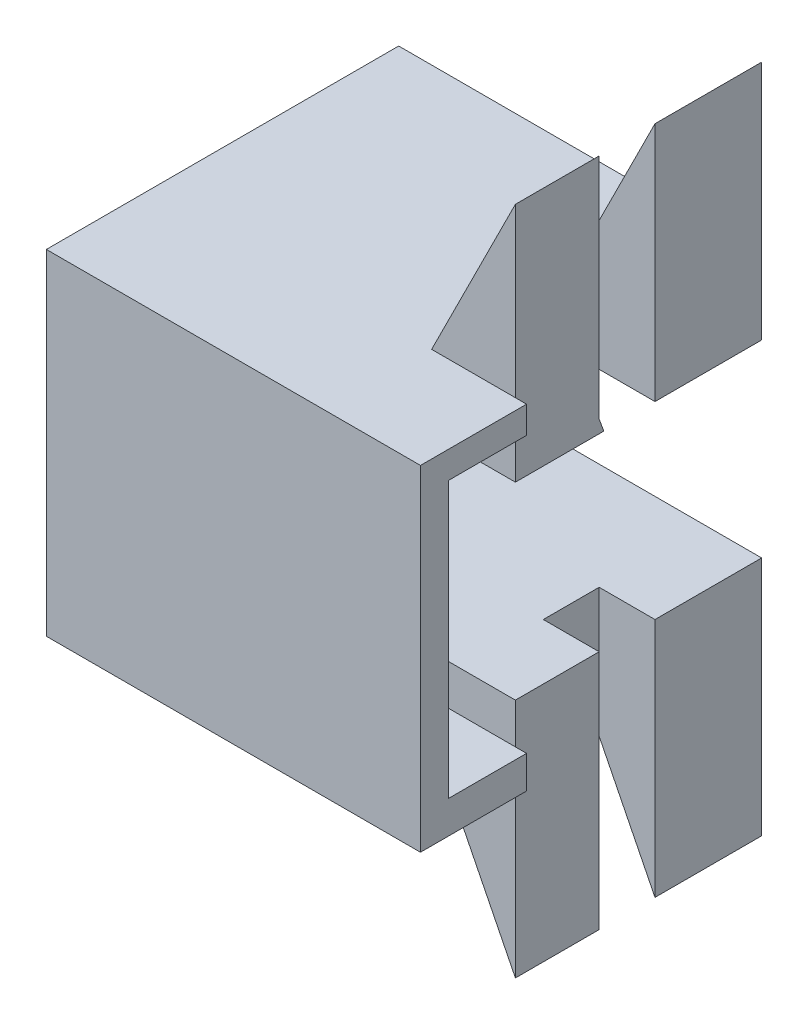
ISO-10303-21;
HEADER;
FILE_DESCRIPTION(('STEP AP214'),'2;1');
FILE_NAME('part.step','',(''),(''),'','','');
FILE_SCHEMA(('AUTOMOTIVE_DESIGN { 1 0 10303 214 1 1 1 1 }'));
ENDSEC;
DATA;
#1=APPLICATION_CONTEXT('core data for automotive mechanical design processes');
#2=APPLICATION_PROTOCOL_DEFINITION('international standard','automotive_design',2000,#1);
#3=PRODUCT_CONTEXT('',#1,'mechanical');
#4=PRODUCT('Part','Part','',(#3));
#5=PRODUCT_RELATED_PRODUCT_CATEGORY('part','',(#4));
#6=PRODUCT_DEFINITION_FORMATION('','',#4);
#7=PRODUCT_DEFINITION_CONTEXT('part definition',#1,'design');
#8=PRODUCT_DEFINITION('design','',#6,#7);
#9=PRODUCT_DEFINITION_SHAPE('','',#8);
#10=(LENGTH_UNIT() NAMED_UNIT(*) SI_UNIT(.MILLI.,.METRE.));
#11=(NAMED_UNIT(*) PLANE_ANGLE_UNIT() SI_UNIT($,.RADIAN.));
#12=(NAMED_UNIT(*) SI_UNIT($,.STERADIAN.) SOLID_ANGLE_UNIT());
#13=UNCERTAINTY_MEASURE_WITH_UNIT(LENGTH_MEASURE(1.E-05),#10,'distance_accuracy_value','');
#14=(GEOMETRIC_REPRESENTATION_CONTEXT(3) GLOBAL_UNCERTAINTY_ASSIGNED_CONTEXT((#13)) GLOBAL_UNIT_ASSIGNED_CONTEXT((#10,
#11,#12)) REPRESENTATION_CONTEXT('',''));
#15=CARTESIAN_POINT('',(0.,0.,0.));
#16=DIRECTION('',(0.,0.,1.));
#17=DIRECTION('',(1.,0.,0.));
#18=AXIS2_PLACEMENT_3D('',#15,#16,#17);
#19=CARTESIAN_POINT('',(0.,0.,44.1));
#20=DIRECTION('',(0.,0.,1.));
#21=DIRECTION('',(1.,0.,0.));
#22=AXIS2_PLACEMENT_3D('',#19,#20,#21);
#23=PLANE('',#22);
#24=DIRECTION('',(-1.,0.,0.));
#25=VECTOR('',#24,1.);
#26=CARTESIAN_POINT('',(0.,0.,44.1));
#27=LINE('',#26,#25);
#28=CARTESIAN_POINT('',(65.,0.,44.1));
#29=VERTEX_POINT('',#28);
#30=CARTESIAN_POINT('',(50.,0.,44.1));
#31=VERTEX_POINT('',#30);
#32=EDGE_CURVE('E11',#29,#31,#27,.T.);
#33=ORIENTED_EDGE('',*,*,#32,.F.);
#34=DIRECTION('',(0.,1.,0.));
#35=VECTOR('',#34,1.);
#36=CARTESIAN_POINT('',(65.,0.,44.1));
#37=LINE('',#36,#35);
#38=CARTESIAN_POINT('',(65.,30.,44.1));
#39=VERTEX_POINT('',#38);
#40=EDGE_CURVE('E378',#29,#39,#37,.T.);
#41=ORIENTED_EDGE('',*,*,#40,.T.);
#42=DIRECTION('',(-0.447213595499957,-0.894427190999916,0.));
#43=VECTOR('',#42,1.);
#44=CARTESIAN_POINT('',(40.,-20.,44.1));
#45=LINE('',#44,#43);
#46=EDGE_CURVE('E382',#39,#31,#45,.T.);
#47=ORIENTED_EDGE('',*,*,#46,.T.);
#48=EDGE_LOOP('',(#33,#41,#47));
#49=FACE_BOUND('',#48,.T.);
#50=ADVANCED_FACE('F37',(#49),#23,.T.);
#51=DIRECTION('',(1.,0.,0.));
#52=VECTOR('',#51,1.);
#53=CARTESIAN_POINT('',(67.,-4.83647532469433,44.1));
#54=LINE('',#53,#52);
#55=CARTESIAN_POINT('',(28.5,-4.83647532469434,44.1));
#56=VERTEX_POINT('',#55);
#57=CARTESIAN_POINT('',(65.,-4.83647532469433,44.1));
#58=VERTEX_POINT('',#57);
#59=EDGE_CURVE('E55',#56,#58,#54,.T.);
#60=ORIENTED_EDGE('',*,*,#59,.F.);
#61=DIRECTION('',(0.,1.,0.));
#62=VECTOR('',#61,1.);
#63=CARTESIAN_POINT('',(28.5,-4.83647532469434,44.1));
#64=LINE('',#63,#62);
#65=CARTESIAN_POINT('',(28.5,-13.1,44.1));
#66=VERTEX_POINT('',#65);
#67=EDGE_CURVE('E46',#66,#56,#64,.T.);
#68=ORIENTED_EDGE('',*,*,#67,.F.);
#69=DIRECTION('',(-1.,0.,0.));
#70=VECTOR('',#69,1.);
#71=CARTESIAN_POINT('',(121.5,-13.1,44.1));
#72=LINE('',#71,#70);
#73=CARTESIAN_POINT('',(65.,-13.1,44.1));
#74=VERTEX_POINT('',#73);
#75=EDGE_CURVE('E349',#74,#66,#72,.T.);
#76=ORIENTED_EDGE('',*,*,#75,.F.);
#77=EDGE_CURVE('E385',#74,#58,#37,.T.);
#78=ORIENTED_EDGE('',*,*,#77,.T.);
#79=EDGE_LOOP('',(#60,#68,#76,#78));
#80=FACE_BOUND('',#79,.T.);
#81=ADVANCED_FACE('F523',(#80),#23,.T.);
#82=CARTESIAN_POINT('',(28.5,-54.1584684873158,44.1));
#83=VERTEX_POINT('',#82);
#84=CARTESIAN_POINT('',(28.5,-46.9,44.1));
#85=VERTEX_POINT('',#84);
#86=EDGE_CURVE('E63',#83,#85,#64,.T.);
#87=ORIENTED_EDGE('',*,*,#86,.F.);
#88=DIRECTION('',(-1.,0.,0.));
#89=VECTOR('',#88,1.);
#90=CARTESIAN_POINT('',(28.5,-54.1584684873158,44.1));
#91=LINE('',#90,#89);
#92=CARTESIAN_POINT('',(65.,-54.1584684873158,44.1));
#93=VERTEX_POINT('',#92);
#94=EDGE_CURVE('E279',#93,#83,#91,.T.);
#95=ORIENTED_EDGE('',*,*,#94,.F.);
#96=CARTESIAN_POINT('',(65.,-46.9,44.1));
#97=VERTEX_POINT('',#96);
#98=EDGE_CURVE('E384',#93,#97,#37,.T.);
#99=ORIENTED_EDGE('',*,*,#98,.T.);
#100=DIRECTION('',(1.,0.,0.));
#101=VECTOR('',#100,1.);
#102=CARTESIAN_POINT('',(121.5,-46.9,44.1));
#103=LINE('',#102,#101);
#104=EDGE_CURVE('E355',#85,#97,#103,.T.);
#105=ORIENTED_EDGE('',*,*,#104,.F.);
#106=EDGE_LOOP('',(#87,#95,#99,#105));
#107=FACE_BOUND('',#106,.T.);
#108=ADVANCED_FACE('F521',(#107),#23,.T.);
#109=CARTESIAN_POINT('',(65.,0.,44.1));
#110=DIRECTION('',(-1.,0.,0.));
#111=DIRECTION('',(0.,-1.,0.));
#112=AXIS2_PLACEMENT_3D('',#109,#110,#111);
#113=PLANE('',#112);
#114=DIRECTION('',(0.,0.,-1.));
#115=VECTOR('',#114,1.);
#116=CARTESIAN_POINT('',(65.,-13.1,44.1));
#117=LINE('',#116,#115);
#118=CARTESIAN_POINT('',(65.,-13.1,28.26075));
#119=VERTEX_POINT('',#118);
#120=EDGE_CURVE('E371',#74,#119,#117,.T.);
#121=ORIENTED_EDGE('',*,*,#120,.T.);
#122=DIRECTION('',(0.,-0.938623250379981,-0.344944044514643));
#123=VECTOR('',#122,1.);
#124=CARTESIAN_POINT('',(65.,-10.7087754461508,29.1395250235396));
#125=LINE('',#124,#123);
#126=CARTESIAN_POINT('',(65.,-10.8163265306122,29.1));
#127=VERTEX_POINT('',#126);
#128=EDGE_CURVE('E301',#127,#119,#125,.T.);
#129=ORIENTED_EDGE('',*,*,#128,.F.);
#130=DIRECTION('',(0.,1.,0.));
#131=VECTOR('',#130,1.);
#132=CARTESIAN_POINT('',(65.,0.,29.1));
#133=LINE('',#132,#131);
#134=CARTESIAN_POINT('',(65.,30.,29.1));
#135=VERTEX_POINT('',#134);
#136=EDGE_CURVE('E311',#127,#135,#133,.T.);
#137=ORIENTED_EDGE('',*,*,#136,.T.);
#138=DIRECTION('',(0.,0.,-1.));
#139=VECTOR('',#138,1.);
#140=CARTESIAN_POINT('',(65.,30.,44.1));
#141=LINE('',#140,#139);
#142=EDGE_CURVE('E412',#39,#135,#141,.T.);
#143=ORIENTED_EDGE('',*,*,#142,.F.);
#144=ORIENTED_EDGE('',*,*,#40,.F.);
#145=EDGE_CURVE('E484',#58,#29,#37,.T.);
#146=ORIENTED_EDGE('',*,*,#145,.F.);
#147=ORIENTED_EDGE('',*,*,#77,.F.);
#148=EDGE_LOOP('',(#121,#129,#137,#143,#144,#146,#147));
#149=FACE_BOUND('',#148,.T.);
#150=ADVANCED_FACE('F481',(#149),#113,.F.);
#151=CARTESIAN_POINT('',(40.,-20.,44.1));
#152=DIRECTION('',(0.894427190999916,-0.447213595499957,0.));
#153=DIRECTION('',(0.447213595499957,0.894427190999916,0.));
#154=AXIS2_PLACEMENT_3D('',#151,#152,#153);
#155=PLANE('',#154);
#156=DIRECTION('',(0.447213595499957,0.894427190999916,0.));
#157=VECTOR('',#156,1.);
#158=CARTESIAN_POINT('',(40.,-20.,29.1));
#159=LINE('',#158,#157);
#160=CARTESIAN_POINT('',(55.,9.99999999999993,29.1));
#161=VERTEX_POINT('',#160);
#162=EDGE_CURVE('E41',#161,#135,#159,.T.);
#163=ORIENTED_EDGE('',*,*,#162,.F.);
#164=DIRECTION('',(0.,0.,1.));
#165=VECTOR('',#164,1.);
#166=CARTESIAN_POINT('',(55.,9.99999999999993,44.1));
#167=LINE('',#166,#165);
#168=CARTESIAN_POINT('',(55.,9.99999999999993,19.1));
#169=VERTEX_POINT('',#168);
#170=EDGE_CURVE('E318',#169,#161,#167,.T.);
#171=ORIENTED_EDGE('',*,*,#170,.F.);
#172=DIRECTION('',(0.447213595499957,0.894427190999916,0.));
#173=VECTOR('',#172,1.);
#174=CARTESIAN_POINT('',(40.,-20.,19.1));
#175=LINE('',#174,#173);
#176=CARTESIAN_POINT('',(65.,30.,19.1));
#177=VERTEX_POINT('',#176);
#178=EDGE_CURVE('E323',#169,#177,#175,.T.);
#179=ORIENTED_EDGE('',*,*,#178,.T.);
#180=CARTESIAN_POINT('',(65.,30.,0.));
#181=VERTEX_POINT('',#180);
#182=EDGE_CURVE('E411',#177,#181,#141,.T.);
#183=ORIENTED_EDGE('',*,*,#182,.T.);
#184=DIRECTION('',(-0.447213595499957,-0.894427190999916,0.));
#185=VECTOR('',#184,1.);
#186=CARTESIAN_POINT('',(40.,-20.,0.));
#187=LINE('',#186,#185);
#188=CARTESIAN_POINT('',(50.,0.,0.));
#189=VERTEX_POINT('',#188);
#190=EDGE_CURVE('E394',#181,#189,#187,.T.);
#191=ORIENTED_EDGE('',*,*,#190,.T.);
#192=DIRECTION('',(0.,0.,-1.));
#193=VECTOR('',#192,1.);
#194=CARTESIAN_POINT('',(50.,0.,44.1));
#195=LINE('',#194,#193);
#196=EDGE_CURVE('E409',#31,#189,#195,.T.);
#197=ORIENTED_EDGE('',*,*,#196,.F.);
#198=ORIENTED_EDGE('',*,*,#46,.F.);
#199=ORIENTED_EDGE('',*,*,#142,.T.);
#200=EDGE_LOOP('',(#163,#171,#179,#183,#191,#197,#198,#199));
#201=FACE_BOUND('',#200,.T.);
#202=ADVANCED_FACE('F469',(#201),#155,.F.);
#203=CARTESIAN_POINT('',(16.,8.00000000000001,44.1));
#204=DIRECTION('',(-0.894427190999916,-0.447213595499958,0.));
#205=DIRECTION('',(0.447213595499958,-0.894427190999916,0.));
#206=AXIS2_PLACEMENT_3D('',#203,#204,#205);
#207=PLANE('',#206);
#208=DIRECTION('',(0.,0.,1.));
#209=VECTOR('',#208,1.);
#210=CARTESIAN_POINT('',(55.,-70.,44.1));
#211=LINE('',#210,#209);
#212=CARTESIAN_POINT('',(55.,-70.,19.1));
#213=VERTEX_POINT('',#212);
#214=CARTESIAN_POINT('',(55.,-70.,29.1));
#215=VERTEX_POINT('',#214);
#216=EDGE_CURVE('E333',#213,#215,#211,.T.);
#217=ORIENTED_EDGE('',*,*,#216,.T.);
#218=DIRECTION('',(0.447213595499958,-0.894427190999916,0.));
#219=VECTOR('',#218,1.);
#220=CARTESIAN_POINT('',(16.,8.00000000000001,29.1));
#221=LINE('',#220,#219);
#222=CARTESIAN_POINT('',(65.,-90.0000000000003,29.1));
#223=VERTEX_POINT('',#222);
#224=EDGE_CURVE('E341',#215,#223,#221,.T.);
#225=ORIENTED_EDGE('',*,*,#224,.T.);
#226=DIRECTION('',(0.,0.,-1.));
#227=VECTOR('',#226,1.);
#228=CARTESIAN_POINT('',(65.,-90.,44.1));
#229=LINE('',#228,#227);
#230=CARTESIAN_POINT('',(65.,-90.,44.1));
#231=VERTEX_POINT('',#230);
#232=EDGE_CURVE('E416',#231,#223,#229,.T.);
#233=ORIENTED_EDGE('',*,*,#232,.F.);
#234=DIRECTION('',(-0.447213595499958,0.894427190999916,0.));
#235=VECTOR('',#234,1.);
#236=CARTESIAN_POINT('',(16.,8.00000000000001,44.1));
#237=LINE('',#236,#235);
#238=CARTESIAN_POINT('',(50.,-60.,44.1));
#239=VERTEX_POINT('',#238);
#240=EDGE_CURVE('E375',#231,#239,#237,.T.);
#241=ORIENTED_EDGE('',*,*,#240,.T.);
#242=DIRECTION('',(0.,0.,-1.));
#243=VECTOR('',#242,1.);
#244=CARTESIAN_POINT('',(50.,-60.,44.1));
#245=LINE('',#244,#243);
#246=CARTESIAN_POINT('',(50.,-60.,0.));
#247=VERTEX_POINT('',#246);
#248=EDGE_CURVE('E387',#239,#247,#245,.T.);
#249=ORIENTED_EDGE('',*,*,#248,.T.);
#250=DIRECTION('',(-0.447213595499958,0.894427190999916,0.));
#251=VECTOR('',#250,1.);
#252=CARTESIAN_POINT('',(16.,8.00000000000001,0.));
#253=LINE('',#252,#251);
#254=CARTESIAN_POINT('',(65.,-90.,0.));
#255=VERTEX_POINT('',#254);
#256=EDGE_CURVE('E374',#255,#247,#253,.T.);
#257=ORIENTED_EDGE('',*,*,#256,.F.);
#258=CARTESIAN_POINT('',(65.,-90.0000000000003,19.1));
#259=VERTEX_POINT('',#258);
#260=EDGE_CURVE('E415',#259,#255,#229,.T.);
#261=ORIENTED_EDGE('',*,*,#260,.F.);
#262=DIRECTION('',(0.447213595499958,-0.894427190999916,0.));
#263=VECTOR('',#262,1.);
#264=CARTESIAN_POINT('',(16.,8.00000000000001,19.1));
#265=LINE('',#264,#263);
#266=EDGE_CURVE('E339',#213,#259,#265,.T.);
#267=ORIENTED_EDGE('',*,*,#266,.F.);
#268=EDGE_LOOP('',(#217,#225,#233,#241,#249,#257,#261,#267));
#269=FACE_BOUND('',#268,.T.);
#270=ADVANCED_FACE('F39',(#269),#207,.T.);
#271=DIRECTION('',(0.,1.,0.));
#272=VECTOR('',#271,1.);
#273=CARTESIAN_POINT('',(65.,0.,29.1));
#274=LINE('',#273,#272);
#275=CARTESIAN_POINT('',(65.,-46.9,29.1));
#276=VERTEX_POINT('',#275);
#277=EDGE_CURVE('E330',#223,#276,#274,.T.);
#278=ORIENTED_EDGE('',*,*,#277,.T.);
#279=DIRECTION('',(0.,0.,1.));
#280=VECTOR('',#279,1.);
#281=CARTESIAN_POINT('',(65.,-46.9,44.1));
#282=LINE('',#281,#280);
#283=EDGE_CURVE('E365',#276,#97,#282,.T.);
#284=ORIENTED_EDGE('',*,*,#283,.T.);
#285=ORIENTED_EDGE('',*,*,#98,.F.);
#286=CARTESIAN_POINT('',(65.,-60.,44.1));
#287=VERTEX_POINT('',#286);
#288=EDGE_CURVE('E383',#287,#93,#37,.T.);
#289=ORIENTED_EDGE('',*,*,#288,.F.);
#290=EDGE_CURVE('E380',#231,#287,#37,.T.);
#291=ORIENTED_EDGE('',*,*,#290,.F.);
#292=ORIENTED_EDGE('',*,*,#232,.T.);
#293=EDGE_LOOP('',(#278,#284,#285,#289,#291,#292));
#294=FACE_BOUND('',#293,.T.);
#295=ADVANCED_FACE('F515',(#294),#113,.F.);
#296=CARTESIAN_POINT('',(121.5,-46.9,0.));
#297=DIRECTION('',(0.,-1.,0.));
#298=DIRECTION('',(0.,0.,-1.));
#299=AXIS2_PLACEMENT_3D('',#296,#297,#298);
#300=PLANE('',#299);
#301=DIRECTION('',(1.,0.,0.));
#302=VECTOR('',#301,1.);
#303=CARTESIAN_POINT('',(121.5,-46.9,29.1));
#304=LINE('',#303,#302);
#305=CARTESIAN_POINT('',(55.,-46.9,29.1));
#306=VERTEX_POINT('',#305);
#307=EDGE_CURVE('E426',#306,#276,#304,.T.);
#308=ORIENTED_EDGE('',*,*,#307,.F.);
#309=DIRECTION('',(0.,0.,1.));
#310=VECTOR('',#309,1.);
#311=CARTESIAN_POINT('',(55.,-46.9,0.));
#312=LINE('',#311,#310);
#313=CARTESIAN_POINT('',(55.,-46.9,19.1));
#314=VERTEX_POINT('',#313);
#315=EDGE_CURVE('E422',#314,#306,#312,.T.);
#316=ORIENTED_EDGE('',*,*,#315,.F.);
#317=DIRECTION('',(1.,0.,0.));
#318=VECTOR('',#317,1.);
#319=CARTESIAN_POINT('',(121.5,-46.9,19.1));
#320=LINE('',#319,#318);
#321=CARTESIAN_POINT('',(65.,-46.9,19.1));
#322=VERTEX_POINT('',#321);
#323=EDGE_CURVE('E424',#314,#322,#320,.T.);
#324=ORIENTED_EDGE('',*,*,#323,.T.);
#325=CARTESIAN_POINT('',(65.,-46.9,0.));
#326=VERTEX_POINT('',#325);
#327=EDGE_CURVE('E367',#326,#322,#282,.T.);
#328=ORIENTED_EDGE('',*,*,#327,.F.);
#329=DIRECTION('',(1.,0.,0.));
#330=VECTOR('',#329,1.);
#331=CARTESIAN_POINT('',(121.5,-46.9,0.));
#332=LINE('',#331,#330);
#333=CARTESIAN_POINT('',(8.50000000000001,-46.9,0.));
#334=VERTEX_POINT('',#333);
#335=EDGE_CURVE('E348',#334,#326,#332,.T.);
#336=ORIENTED_EDGE('',*,*,#335,.F.);
#337=DIRECTION('',(0.,0.,1.));
#338=VECTOR('',#337,1.);
#339=CARTESIAN_POINT('',(8.50000000000001,-46.9,0.));
#340=LINE('',#339,#338);
#341=CARTESIAN_POINT('',(8.50000000000001,-46.9,44.1));
#342=VERTEX_POINT('',#341);
#343=EDGE_CURVE('E352',#334,#342,#340,.T.);
#344=ORIENTED_EDGE('',*,*,#343,.T.);
#345=EDGE_CURVE('E356',#342,#85,#103,.T.);
#346=ORIENTED_EDGE('',*,*,#345,.T.);
#347=ORIENTED_EDGE('',*,*,#104,.T.);
#348=ORIENTED_EDGE('',*,*,#283,.F.);
#349=EDGE_LOOP('',(#308,#316,#324,#328,#336,#344,#346,#347,#348));
#350=FACE_BOUND('',#349,.T.);
#351=ADVANCED_FACE('F519',(#350),#300,.F.);
#352=ORIENTED_EDGE('',*,*,#182,.F.);
#353=DIRECTION('',(0.,1.,0.));
#354=VECTOR('',#353,1.);
#355=CARTESIAN_POINT('',(65.,0.,19.1));
#356=LINE('',#355,#354);
#357=CARTESIAN_POINT('',(65.,-13.1,19.1));
#358=VERTEX_POINT('',#357);
#359=EDGE_CURVE('E296',#358,#177,#356,.T.);
#360=ORIENTED_EDGE('',*,*,#359,.F.);
#361=CARTESIAN_POINT('',(65.,-13.1,0.));
#362=VERTEX_POINT('',#361);
#363=EDGE_CURVE('E370',#358,#362,#117,.T.);
#364=ORIENTED_EDGE('',*,*,#363,.T.);
#365=DIRECTION('',(0.,1.,0.));
#366=VECTOR('',#365,1.);
#367=CARTESIAN_POINT('',(65.,0.,0.));
#368=LINE('',#367,#366);
#369=EDGE_CURVE('E390',#362,#181,#368,.T.);
#370=ORIENTED_EDGE('',*,*,#369,.T.);
#371=EDGE_LOOP('',(#352,#360,#364,#370));
#372=FACE_BOUND('',#371,.T.);
#373=ADVANCED_FACE('F464',(#372),#113,.F.);
#374=ORIENTED_EDGE('',*,*,#327,.T.);
#375=DIRECTION('',(0.,1.,0.));
#376=VECTOR('',#375,1.);
#377=CARTESIAN_POINT('',(65.,0.,19.1));
#378=LINE('',#377,#376);
#379=EDGE_CURVE('E326',#259,#322,#378,.T.);
#380=ORIENTED_EDGE('',*,*,#379,.F.);
#381=ORIENTED_EDGE('',*,*,#260,.T.);
#382=EDGE_CURVE('E391',#255,#326,#368,.T.);
#383=ORIENTED_EDGE('',*,*,#382,.T.);
#384=EDGE_LOOP('',(#374,#380,#381,#383));
#385=FACE_BOUND('',#384,.T.);
#386=ADVANCED_FACE('F529',(#385),#113,.F.);
#387=CARTESIAN_POINT('',(0.,0.,44.1));
#388=DIRECTION('',(0.,1.,0.));
#389=DIRECTION('',(0.,0.,1.));
#390=AXIS2_PLACEMENT_3D('',#387,#388,#389);
#391=PLANE('',#390);
#392=DIRECTION('',(1.,0.,0.));
#393=VECTOR('',#392,1.);
#394=CARTESIAN_POINT('',(0.,0.,0.));
#395=LINE('',#394,#393);
#396=CARTESIAN_POINT('',(0.,0.,0.));
#397=VERTEX_POINT('',#396);
#398=EDGE_CURVE('E397',#397,#189,#395,.T.);
#399=ORIENTED_EDGE('',*,*,#398,.F.);
#400=DIRECTION('',(0.,0.,-1.));
#401=VECTOR('',#400,1.);
#402=CARTESIAN_POINT('',(0.,0.,44.1));
#403=LINE('',#402,#401);
#404=CARTESIAN_POINT('',(0.,0.,63.1));
#405=VERTEX_POINT('',#404);
#406=EDGE_CURVE('E245',#405,#397,#403,.T.);
#407=ORIENTED_EDGE('',*,*,#406,.F.);
#408=DIRECTION('',(-1.,0.,0.));
#409=VECTOR('',#408,1.);
#410=CARTESIAN_POINT('',(0.,0.,63.1));
#411=LINE('',#410,#409);
#412=CARTESIAN_POINT('',(67.,0.,63.1));
#413=VERTEX_POINT('',#412);
#414=EDGE_CURVE('E242',#413,#405,#411,.T.);
#415=ORIENTED_EDGE('',*,*,#414,.F.);
#416=DIRECTION('',(0.,0.,-1.));
#417=VECTOR('',#416,1.);
#418=CARTESIAN_POINT('',(67.,0.,58.1));
#419=LINE('',#418,#417);
#420=CARTESIAN_POINT('',(67.,0.,44.1));
#421=VERTEX_POINT('',#420);
#422=EDGE_CURVE('E226',#413,#421,#419,.T.);
#423=ORIENTED_EDGE('',*,*,#422,.T.);
#424=EDGE_CURVE('E48',#421,#29,#27,.T.);
#425=ORIENTED_EDGE('',*,*,#424,.T.);
#426=ORIENTED_EDGE('',*,*,#32,.T.);
#427=ORIENTED_EDGE('',*,*,#196,.T.);
#428=EDGE_LOOP('',(#399,#407,#415,#423,#425,#426,#427));
#429=FACE_BOUND('',#428,.T.);
#430=ADVANCED_FACE('F244',(#429),#391,.T.);
#431=CARTESIAN_POINT('',(0.,0.,44.1));
#432=DIRECTION('',(1.,0.,0.));
#433=DIRECTION('',(0.,0.,-1.));
#434=AXIS2_PLACEMENT_3D('',#431,#432,#433);
#435=PLANE('',#434);
#436=DIRECTION('',(0.,-1.,0.));
#437=VECTOR('',#436,1.);
#438=CARTESIAN_POINT('',(0.,0.,0.));
#439=LINE('',#438,#437);
#440=CARTESIAN_POINT('',(0.,-60.,0.));
#441=VERTEX_POINT('',#440);
#442=EDGE_CURVE('E400',#397,#441,#439,.T.);
#443=ORIENTED_EDGE('',*,*,#442,.T.);
#444=DIRECTION('',(0.,0.,-1.));
#445=VECTOR('',#444,1.);
#446=CARTESIAN_POINT('',(0.,-60.,44.1));
#447=LINE('',#446,#445);
#448=CARTESIAN_POINT('',(0.,-60.,63.1));
#449=VERTEX_POINT('',#448);
#450=EDGE_CURVE('E405',#449,#441,#447,.T.);
#451=ORIENTED_EDGE('',*,*,#450,.F.);
#452=DIRECTION('',(0.,-1.,0.));
#453=VECTOR('',#452,1.);
#454=CARTESIAN_POINT('',(0.,0.,63.1));
#455=LINE('',#454,#453);
#456=EDGE_CURVE('E249',#405,#449,#455,.T.);
#457=ORIENTED_EDGE('',*,*,#456,.F.);
#458=ORIENTED_EDGE('',*,*,#406,.T.);
#459=EDGE_LOOP('',(#443,#451,#457,#458));
#460=FACE_BOUND('',#459,.T.);
#461=ADVANCED_FACE('F660',(#460),#435,.F.);
#462=CARTESIAN_POINT('',(0.,-60.,44.1));
#463=DIRECTION('',(0.,1.,0.));
#464=DIRECTION('',(0.,0.,1.));
#465=AXIS2_PLACEMENT_3D('',#462,#463,#464);
#466=PLANE('',#465);
#467=DIRECTION('',(1.,0.,0.));
#468=VECTOR('',#467,1.);
#469=CARTESIAN_POINT('',(0.,-60.,0.));
#470=LINE('',#469,#468);
#471=EDGE_CURVE('E379',#441,#247,#470,.T.);
#472=ORIENTED_EDGE('',*,*,#471,.T.);
#473=ORIENTED_EDGE('',*,*,#248,.F.);
#474=DIRECTION('',(1.,0.,0.));
#475=VECTOR('',#474,1.);
#476=CARTESIAN_POINT('',(67.,-60.,44.1));
#477=LINE('',#476,#475);
#478=EDGE_CURVE('E273',#239,#287,#477,.T.);
#479=ORIENTED_EDGE('',*,*,#478,.T.);
#480=CARTESIAN_POINT('',(67.,-60.,44.1));
#481=VERTEX_POINT('',#480);
#482=EDGE_CURVE('E270',#287,#481,#477,.T.);
#483=ORIENTED_EDGE('',*,*,#482,.T.);
#484=DIRECTION('',(0.,0.,-1.));
#485=VECTOR('',#484,1.);
#486=CARTESIAN_POINT('',(67.,-60.,58.1));
#487=LINE('',#486,#485);
#488=CARTESIAN_POINT('',(67.,-60.,63.1));
#489=VERTEX_POINT('',#488);
#490=EDGE_CURVE('E294',#489,#481,#487,.T.);
#491=ORIENTED_EDGE('',*,*,#490,.F.);
#492=DIRECTION('',(1.,0.,0.));
#493=VECTOR('',#492,1.);
#494=CARTESIAN_POINT('',(0.,-60.,63.1));
#495=LINE('',#494,#493);
#496=EDGE_CURVE('E254',#449,#489,#495,.T.);
#497=ORIENTED_EDGE('',*,*,#496,.F.);
#498=ORIENTED_EDGE('',*,*,#450,.T.);
#499=EDGE_LOOP('',(#472,#473,#479,#483,#491,#497,#498));
#500=FACE_BOUND('',#499,.T.);
#501=ADVANCED_FACE('F503',(#500),#466,.F.);
#502=ORIENTED_EDGE('',*,*,#478,.F.);
#503=ORIENTED_EDGE('',*,*,#240,.F.);
#504=ORIENTED_EDGE('',*,*,#290,.T.);
#505=EDGE_LOOP('',(#502,#503,#504));
#506=FACE_BOUND('',#505,.T.);
#507=ADVANCED_FACE('F514',(#506),#23,.T.);
#508=CARTESIAN_POINT('',(0.,0.,0.));
#509=DIRECTION('',(0.,0.,1.));
#510=DIRECTION('',(1.,0.,0.));
#511=AXIS2_PLACEMENT_3D('',#508,#509,#510);
#512=PLANE('',#511);
#513=ORIENTED_EDGE('',*,*,#369,.F.);
#514=DIRECTION('',(-1.,0.,0.));
#515=VECTOR('',#514,1.);
#516=CARTESIAN_POINT('',(0.,-13.1,0.));
#517=LINE('',#516,#515);
#518=CARTESIAN_POINT('',(8.5,-13.1,0.));
#519=VERTEX_POINT('',#518);
#520=EDGE_CURVE('E419',#362,#519,#517,.T.);
#521=ORIENTED_EDGE('',*,*,#520,.T.);
#522=DIRECTION('',(0.,-1.,0.));
#523=VECTOR('',#522,1.);
#524=CARTESIAN_POINT('',(8.50000000000001,-46.9,0.));
#525=LINE('',#524,#523);
#526=EDGE_CURVE('E345',#519,#334,#525,.T.);
#527=ORIENTED_EDGE('',*,*,#526,.T.);
#528=ORIENTED_EDGE('',*,*,#335,.T.);
#529=ORIENTED_EDGE('',*,*,#382,.F.);
#530=ORIENTED_EDGE('',*,*,#256,.T.);
#531=ORIENTED_EDGE('',*,*,#471,.F.);
#532=ORIENTED_EDGE('',*,*,#442,.F.);
#533=ORIENTED_EDGE('',*,*,#398,.T.);
#534=ORIENTED_EDGE('',*,*,#190,.F.);
#535=EDGE_LOOP('',(#513,#521,#527,#528,#529,#530,#531,#532,#533,#534));
#536=FACE_BOUND('',#535,.T.);
#537=ADVANCED_FACE('F456',(#536),#512,.F.);
#538=CARTESIAN_POINT('',(121.5,-13.1,0.));
#539=DIRECTION('',(0.,1.,0.));
#540=DIRECTION('',(-1.,0.,0.));
#541=AXIS2_PLACEMENT_3D('',#538,#539,#540);
#542=PLANE('',#541);
#543=DIRECTION('',(0.,0.,-1.));
#544=VECTOR('',#543,1.);
#545=CARTESIAN_POINT('',(55.,-13.1,0.));
#546=LINE('',#545,#544);
#547=CARTESIAN_POINT('',(55.,-13.1,28.26075));
#548=VERTEX_POINT('',#547);
#549=CARTESIAN_POINT('',(55.,-13.1,19.1));
#550=VERTEX_POINT('',#549);
#551=EDGE_CURVE('E297',#548,#550,#546,.T.);
#552=ORIENTED_EDGE('',*,*,#551,.F.);
#553=DIRECTION('',(1.,0.,0.));
#554=VECTOR('',#553,1.);
#555=CARTESIAN_POINT('',(55.,-13.1,28.26075));
#556=LINE('',#555,#554);
#557=EDGE_CURVE('E315',#548,#119,#556,.T.);
#558=ORIENTED_EDGE('',*,*,#557,.T.);
#559=ORIENTED_EDGE('',*,*,#120,.F.);
#560=ORIENTED_EDGE('',*,*,#75,.T.);
#561=CARTESIAN_POINT('',(8.5,-13.1,44.1));
#562=VERTEX_POINT('',#561);
#563=EDGE_CURVE('E359',#66,#562,#72,.T.);
#564=ORIENTED_EDGE('',*,*,#563,.T.);
#565=DIRECTION('',(0.,0.,1.));
#566=VECTOR('',#565,1.);
#567=CARTESIAN_POINT('',(8.5,-13.1,0.));
#568=LINE('',#567,#566);
#569=EDGE_CURVE('E362',#519,#562,#568,.T.);
#570=ORIENTED_EDGE('',*,*,#569,.F.);
#571=ORIENTED_EDGE('',*,*,#520,.F.);
#572=ORIENTED_EDGE('',*,*,#363,.F.);
#573=DIRECTION('',(1.,0.,0.));
#574=VECTOR('',#573,1.);
#575=CARTESIAN_POINT('',(55.,-13.1,19.1));
#576=LINE('',#575,#574);
#577=EDGE_CURVE('E309',#550,#358,#576,.T.);
#578=ORIENTED_EDGE('',*,*,#577,.F.);
#579=EDGE_LOOP('',(#552,#558,#559,#560,#564,#570,#571,#572,#578));
#580=FACE_BOUND('',#579,.T.);
#581=ADVANCED_FACE('F447',(#580),#542,.F.);
#582=CARTESIAN_POINT('',(8.50000000000001,-46.9,0.));
#583=DIRECTION('',(-1.,0.,0.));
#584=DIRECTION('',(0.,-1.,0.));
#585=AXIS2_PLACEMENT_3D('',#582,#583,#584);
#586=PLANE('',#585);
#587=DIRECTION('',(0.,-1.,0.));
#588=VECTOR('',#587,1.);
#589=CARTESIAN_POINT('',(8.50000000000001,-46.9,44.1));
#590=LINE('',#589,#588);
#591=EDGE_CURVE('E344',#562,#342,#590,.T.);
#592=ORIENTED_EDGE('',*,*,#591,.T.);
#593=ORIENTED_EDGE('',*,*,#343,.F.);
#594=ORIENTED_EDGE('',*,*,#526,.F.);
#595=ORIENTED_EDGE('',*,*,#569,.T.);
#596=EDGE_LOOP('',(#592,#593,#594,#595));
#597=FACE_BOUND('',#596,.T.);
#598=ADVANCED_FACE('F452',(#597),#586,.F.);
#599=CARTESIAN_POINT('',(55.,0.,29.1));
#600=DIRECTION('',(0.,0.,-1.));
#601=DIRECTION('',(-1.,0.,0.));
#602=AXIS2_PLACEMENT_3D('',#599,#600,#601);
#603=PLANE('',#602);
#604=DIRECTION('',(0.,1.,0.));
#605=VECTOR('',#604,1.);
#606=CARTESIAN_POINT('',(55.,0.,29.1));
#607=LINE('',#606,#605);
#608=EDGE_CURVE('E329',#215,#306,#607,.T.);
#609=ORIENTED_EDGE('',*,*,#608,.T.);
#610=ORIENTED_EDGE('',*,*,#307,.T.);
#611=ORIENTED_EDGE('',*,*,#277,.F.);
#612=ORIENTED_EDGE('',*,*,#224,.F.);
#613=EDGE_LOOP('',(#609,#610,#611,#612));
#614=FACE_BOUND('',#613,.T.);
#615=ADVANCED_FACE('F575',(#614),#603,.T.);
#616=CARTESIAN_POINT('',(55.,0.,19.1));
#617=DIRECTION('',(0.,0.,-1.));
#618=DIRECTION('',(-1.,0.,0.));
#619=AXIS2_PLACEMENT_3D('',#616,#617,#618);
#620=PLANE('',#619);
#621=ORIENTED_EDGE('',*,*,#266,.T.);
#622=ORIENTED_EDGE('',*,*,#379,.T.);
#623=ORIENTED_EDGE('',*,*,#323,.F.);
#624=DIRECTION('',(0.,1.,0.));
#625=VECTOR('',#624,1.);
#626=CARTESIAN_POINT('',(55.,0.,19.1));
#627=LINE('',#626,#625);
#628=EDGE_CURVE('E327',#213,#314,#627,.T.);
#629=ORIENTED_EDGE('',*,*,#628,.F.);
#630=EDGE_LOOP('',(#621,#622,#623,#629));
#631=FACE_BOUND('',#630,.T.);
#632=ADVANCED_FACE('F573',(#631),#620,.F.);
#633=CARTESIAN_POINT('',(55.,0.,0.));
#634=DIRECTION('',(1.,0.,0.));
#635=DIRECTION('',(0.,1.,0.));
#636=AXIS2_PLACEMENT_3D('',#633,#634,#635);
#637=PLANE('',#636);
#638=ORIENTED_EDGE('',*,*,#628,.T.);
#639=ORIENTED_EDGE('',*,*,#315,.T.);
#640=ORIENTED_EDGE('',*,*,#608,.F.);
#641=ORIENTED_EDGE('',*,*,#216,.F.);
#642=EDGE_LOOP('',(#638,#639,#640,#641));
#643=FACE_BOUND('',#642,.T.);
#644=ADVANCED_FACE('F568',(#643),#637,.T.);
#645=CARTESIAN_POINT('',(55.,0.,29.1));
#646=DIRECTION('',(0.,0.,-1.));
#647=DIRECTION('',(-1.,0.,0.));
#648=AXIS2_PLACEMENT_3D('',#645,#646,#647);
#649=PLANE('',#648);
#650=ORIENTED_EDGE('',*,*,#162,.T.);
#651=ORIENTED_EDGE('',*,*,#136,.F.);
#652=DIRECTION('',(1.,0.,0.));
#653=VECTOR('',#652,1.);
#654=CARTESIAN_POINT('',(55.,-10.8163265306122,29.1));
#655=LINE('',#654,#653);
#656=CARTESIAN_POINT('',(55.,-10.8163265306122,29.1));
#657=VERTEX_POINT('',#656);
#658=EDGE_CURVE('E319',#657,#127,#655,.T.);
#659=ORIENTED_EDGE('',*,*,#658,.F.);
#660=DIRECTION('',(0.,1.,0.));
#661=VECTOR('',#660,1.);
#662=CARTESIAN_POINT('',(55.,0.,29.1));
#663=LINE('',#662,#661);
#664=EDGE_CURVE('E304',#657,#161,#663,.T.);
#665=ORIENTED_EDGE('',*,*,#664,.T.);
#666=EDGE_LOOP('',(#650,#651,#659,#665));
#667=FACE_BOUND('',#666,.T.);
#668=ADVANCED_FACE('F474',(#667),#649,.T.);
#669=CARTESIAN_POINT('',(55.,0.,19.1));
#670=DIRECTION('',(0.,0.,-1.));
#671=DIRECTION('',(-1.,0.,0.));
#672=AXIS2_PLACEMENT_3D('',#669,#670,#671);
#673=PLANE('',#672);
#674=DIRECTION('',(0.,1.,0.));
#675=VECTOR('',#674,1.);
#676=CARTESIAN_POINT('',(55.,0.,19.1));
#677=LINE('',#676,#675);
#678=EDGE_CURVE('E300',#550,#169,#677,.T.);
#679=ORIENTED_EDGE('',*,*,#678,.F.);
#680=ORIENTED_EDGE('',*,*,#577,.T.);
#681=ORIENTED_EDGE('',*,*,#359,.T.);
#682=ORIENTED_EDGE('',*,*,#178,.F.);
#683=EDGE_LOOP('',(#679,#680,#681,#682));
#684=FACE_BOUND('',#683,.T.);
#685=ADVANCED_FACE('F466',(#684),#673,.F.);
#686=CARTESIAN_POINT('',(55.,0.,0.));
#687=DIRECTION('',(1.,0.,0.));
#688=DIRECTION('',(0.,1.,0.));
#689=AXIS2_PLACEMENT_3D('',#686,#687,#688);
#690=PLANE('',#689);
#691=ORIENTED_EDGE('',*,*,#170,.T.);
#692=ORIENTED_EDGE('',*,*,#664,.F.);
#693=DIRECTION('',(0.,-0.938623250379981,-0.344944044514643));
#694=VECTOR('',#693,1.);
#695=CARTESIAN_POINT('',(55.,-10.7087754461508,29.1395250235396));
#696=LINE('',#695,#694);
#697=EDGE_CURVE('E307',#657,#548,#696,.T.);
#698=ORIENTED_EDGE('',*,*,#697,.T.);
#699=ORIENTED_EDGE('',*,*,#551,.T.);
#700=ORIENTED_EDGE('',*,*,#678,.T.);
#701=EDGE_LOOP('',(#691,#692,#698,#699,#700));
#702=FACE_BOUND('',#701,.T.);
#703=ADVANCED_FACE('F472',(#702),#690,.T.);
#704=CARTESIAN_POINT('',(55.,-10.7087754461508,29.1395250235396));
#705=DIRECTION('',(0.,-0.344944044514643,0.938623250379981));
#706=DIRECTION('',(0.,-0.938623250379981,-0.344944044514643));
#707=AXIS2_PLACEMENT_3D('',#704,#705,#706);
#708=PLANE('',#707);
#709=ORIENTED_EDGE('',*,*,#128,.T.);
#710=ORIENTED_EDGE('',*,*,#557,.F.);
#711=ORIENTED_EDGE('',*,*,#697,.F.);
#712=ORIENTED_EDGE('',*,*,#658,.T.);
#713=EDGE_LOOP('',(#709,#710,#711,#712));
#714=FACE_BOUND('',#713,.T.);
#715=ADVANCED_FACE('F477',(#714),#708,.F.);
#716=CARTESIAN_POINT('',(0.,0.,44.1));
#717=DIRECTION('',(0.,0.,-1.));
#718=DIRECTION('',(-1.,0.,0.));
#719=AXIS2_PLACEMENT_3D('',#716,#717,#718);
#720=PLANE('',#719);
#721=CARTESIAN_POINT('',(67.,-4.83647532469433,44.1));
#722=VERTEX_POINT('',#721);
#723=EDGE_CURVE('E281',#58,#722,#54,.T.);
#724=ORIENTED_EDGE('',*,*,#723,.F.);
#725=ORIENTED_EDGE('',*,*,#145,.T.);
#726=ORIENTED_EDGE('',*,*,#424,.F.);
#727=DIRECTION('',(0.,1.,0.));
#728=VECTOR('',#727,1.);
#729=CARTESIAN_POINT('',(67.,0.,44.1));
#730=LINE('',#729,#728);
#731=EDGE_CURVE('E234',#722,#421,#730,.T.);
#732=ORIENTED_EDGE('',*,*,#731,.F.);
#733=EDGE_LOOP('',(#724,#725,#726,#732));
#734=FACE_BOUND('',#733,.T.);
#735=ADVANCED_FACE('F538',(#734),#720,.T.);
#736=ORIENTED_EDGE('',*,*,#563,.F.);
#737=EDGE_CURVE('E278',#85,#66,#64,.T.);
#738=ORIENTED_EDGE('',*,*,#737,.F.);
#739=ORIENTED_EDGE('',*,*,#345,.F.);
#740=ORIENTED_EDGE('',*,*,#591,.F.);
#741=EDGE_LOOP('',(#736,#738,#739,#740));
#742=FACE_BOUND('',#741,.T.);
#743=ADVANCED_FACE('F443',(#742),#720,.T.);
#744=CARTESIAN_POINT('',(67.,-54.1584684873158,58.1));
#745=DIRECTION('',(-1.,0.,0.));
#746=DIRECTION('',(0.,0.,1.));
#747=AXIS2_PLACEMENT_3D('',#744,#745,#746);
#748=PLANE('',#747);
#749=DIRECTION('',(0.,1.,0.));
#750=VECTOR('',#749,1.);
#751=CARTESIAN_POINT('',(67.,-54.1584684873158,44.1));
#752=LINE('',#751,#750);
#753=CARTESIAN_POINT('',(67.,-54.1584684873158,44.1));
#754=VERTEX_POINT('',#753);
#755=EDGE_CURVE('E272',#481,#754,#752,.T.);
#756=ORIENTED_EDGE('',*,*,#755,.T.);
#757=DIRECTION('',(0.,0.,-1.));
#758=VECTOR('',#757,1.);
#759=CARTESIAN_POINT('',(67.,-54.1584684873158,58.1));
#760=LINE('',#759,#758);
#761=CARTESIAN_POINT('',(67.,-54.1584684873158,58.1));
#762=VERTEX_POINT('',#761);
#763=EDGE_CURVE('E291',#762,#754,#760,.T.);
#764=ORIENTED_EDGE('',*,*,#763,.F.);
#765=DIRECTION('',(0.,1.,0.));
#766=VECTOR('',#765,1.);
#767=CARTESIAN_POINT('',(67.,0.,58.1));
#768=LINE('',#767,#766);
#769=CARTESIAN_POINT('',(67.,-4.83647532469433,58.1));
#770=VERTEX_POINT('',#769);
#771=EDGE_CURVE('E255',#762,#770,#768,.T.);
#772=ORIENTED_EDGE('',*,*,#771,.T.);
#773=DIRECTION('',(0.,0.,-1.));
#774=VECTOR('',#773,1.);
#775=CARTESIAN_POINT('',(67.,-4.83647532469433,58.1));
#776=LINE('',#775,#774);
#777=EDGE_CURVE('E238',#770,#722,#776,.T.);
#778=ORIENTED_EDGE('',*,*,#777,.T.);
#779=ORIENTED_EDGE('',*,*,#731,.T.);
#780=ORIENTED_EDGE('',*,*,#422,.F.);
#781=DIRECTION('',(0.,1.,0.));
#782=VECTOR('',#781,1.);
#783=CARTESIAN_POINT('',(67.,0.,63.1));
#784=LINE('',#783,#782);
#785=EDGE_CURVE('E231',#489,#413,#784,.T.);
#786=ORIENTED_EDGE('',*,*,#785,.F.);
#787=ORIENTED_EDGE('',*,*,#490,.T.);
#788=EDGE_LOOP('',(#756,#764,#772,#778,#779,#780,#786,#787));
#789=FACE_BOUND('',#788,.T.);
#790=ADVANCED_FACE('F228',(#789),#748,.F.);
#791=CARTESIAN_POINT('',(28.5,-54.1584684873158,58.1));
#792=DIRECTION('',(0.,-1.,0.));
#793=DIRECTION('',(0.,0.,-1.));
#794=AXIS2_PLACEMENT_3D('',#791,#792,#793);
#795=PLANE('',#794);
#796=EDGE_CURVE('E275',#754,#93,#91,.T.);
#797=ORIENTED_EDGE('',*,*,#796,.T.);
#798=ORIENTED_EDGE('',*,*,#94,.T.);
#799=DIRECTION('',(0.,0.,-1.));
#800=VECTOR('',#799,1.);
#801=CARTESIAN_POINT('',(28.5,-54.1584684873158,58.1));
#802=LINE('',#801,#800);
#803=CARTESIAN_POINT('',(28.5,-54.1584684873158,58.1));
#804=VERTEX_POINT('',#803);
#805=EDGE_CURVE('E288',#804,#83,#802,.T.);
#806=ORIENTED_EDGE('',*,*,#805,.F.);
#807=DIRECTION('',(-1.,0.,0.));
#808=VECTOR('',#807,1.);
#809=CARTESIAN_POINT('',(28.5,-54.1584684873158,58.1));
#810=LINE('',#809,#808);
#811=EDGE_CURVE('E262',#762,#804,#810,.T.);
#812=ORIENTED_EDGE('',*,*,#811,.F.);
#813=ORIENTED_EDGE('',*,*,#763,.T.);
#814=EDGE_LOOP('',(#797,#798,#806,#812,#813));
#815=FACE_BOUND('',#814,.T.);
#816=ADVANCED_FACE('F500',(#815),#795,.F.);
#817=CARTESIAN_POINT('',(28.5,-4.83647532469434,58.1));
#818=DIRECTION('',(-1.,0.,0.));
#819=DIRECTION('',(0.,-1.,0.));
#820=AXIS2_PLACEMENT_3D('',#817,#818,#819);
#821=PLANE('',#820);
#822=ORIENTED_EDGE('',*,*,#86,.T.);
#823=ORIENTED_EDGE('',*,*,#737,.T.);
#824=ORIENTED_EDGE('',*,*,#67,.T.);
#825=DIRECTION('',(0.,0.,-1.));
#826=VECTOR('',#825,1.);
#827=CARTESIAN_POINT('',(28.5,-4.83647532469434,58.1));
#828=LINE('',#827,#826);
#829=CARTESIAN_POINT('',(28.5,-4.83647532469434,58.1));
#830=VERTEX_POINT('',#829);
#831=EDGE_CURVE('E285',#830,#56,#828,.T.);
#832=ORIENTED_EDGE('',*,*,#831,.F.);
#833=DIRECTION('',(0.,1.,0.));
#834=VECTOR('',#833,1.);
#835=CARTESIAN_POINT('',(28.5,-4.83647532469434,58.1));
#836=LINE('',#835,#834);
#837=EDGE_CURVE('E265',#804,#830,#836,.T.);
#838=ORIENTED_EDGE('',*,*,#837,.F.);
#839=ORIENTED_EDGE('',*,*,#805,.T.);
#840=EDGE_LOOP('',(#822,#823,#824,#832,#838,#839));
#841=FACE_BOUND('',#840,.T.);
#842=ADVANCED_FACE('F439',(#841),#821,.F.);
#843=CARTESIAN_POINT('',(67.,-4.83647532469433,58.1));
#844=DIRECTION('',(0.,1.,0.));
#845=DIRECTION('',(-1.,0.,0.));
#846=AXIS2_PLACEMENT_3D('',#843,#844,#845);
#847=PLANE('',#846);
#848=ORIENTED_EDGE('',*,*,#59,.T.);
#849=ORIENTED_EDGE('',*,*,#723,.T.);
#850=ORIENTED_EDGE('',*,*,#777,.F.);
#851=DIRECTION('',(1.,0.,0.));
#852=VECTOR('',#851,1.);
#853=CARTESIAN_POINT('',(67.,-4.83647532469433,58.1));
#854=LINE('',#853,#852);
#855=EDGE_CURVE('E239',#830,#770,#854,.T.);
#856=ORIENTED_EDGE('',*,*,#855,.F.);
#857=ORIENTED_EDGE('',*,*,#831,.T.);
#858=EDGE_LOOP('',(#848,#849,#850,#856,#857));
#859=FACE_BOUND('',#858,.T.);
#860=ADVANCED_FACE('F540',(#859),#847,.F.);
#861=ORIENTED_EDGE('',*,*,#482,.F.);
#862=ORIENTED_EDGE('',*,*,#288,.T.);
#863=ORIENTED_EDGE('',*,*,#796,.F.);
#864=ORIENTED_EDGE('',*,*,#755,.F.);
#865=EDGE_LOOP('',(#861,#862,#863,#864));
#866=FACE_BOUND('',#865,.T.);
#867=ADVANCED_FACE('F495',(#866),#720,.T.);
#868=CARTESIAN_POINT('',(0.,0.,58.1));
#869=DIRECTION('',(0.,0.,1.));
#870=DIRECTION('',(1.,0.,0.));
#871=AXIS2_PLACEMENT_3D('',#868,#869,#870);
#872=PLANE('',#871);
#873=ORIENTED_EDGE('',*,*,#771,.F.);
#874=ORIENTED_EDGE('',*,*,#811,.T.);
#875=ORIENTED_EDGE('',*,*,#837,.T.);
#876=ORIENTED_EDGE('',*,*,#855,.T.);
#877=EDGE_LOOP('',(#873,#874,#875,#876));
#878=FACE_BOUND('',#877,.T.);
#879=ADVANCED_FACE('F544',(#878),#872,.F.);
#880=CARTESIAN_POINT('',(0.,0.,63.1));
#881=DIRECTION('',(0.,0.,1.));
#882=DIRECTION('',(1.,0.,0.));
#883=AXIS2_PLACEMENT_3D('',#880,#881,#882);
#884=PLANE('',#883);
#885=ORIENTED_EDGE('',*,*,#785,.T.);
#886=ORIENTED_EDGE('',*,*,#414,.T.);
#887=ORIENTED_EDGE('',*,*,#456,.T.);
#888=ORIENTED_EDGE('',*,*,#496,.T.);
#889=EDGE_LOOP('',(#885,#886,#887,#888));
#890=FACE_BOUND('',#889,.T.);
#891=ADVANCED_FACE('F252',(#890),#884,.T.);
#892=CLOSED_SHELL('',(#50,#81,#108,#150,#202,#270,#295,#351,#373,#386,#430,#461,#501,#507,#537,
#581,#598,#615,#632,#644,#668,#685,#703,#715,#735,#743,#790,#816,#842,#860,#867,#879,#891));
#893=MANIFOLD_SOLID_BREP('B2',#892);
#894=ADVANCED_BREP_SHAPE_REPRESENTATION('',(#18,#893),#14);
#895=SHAPE_DEFINITION_REPRESENTATION(#9,#894);
ENDSEC;
END-ISO-10303-21;
